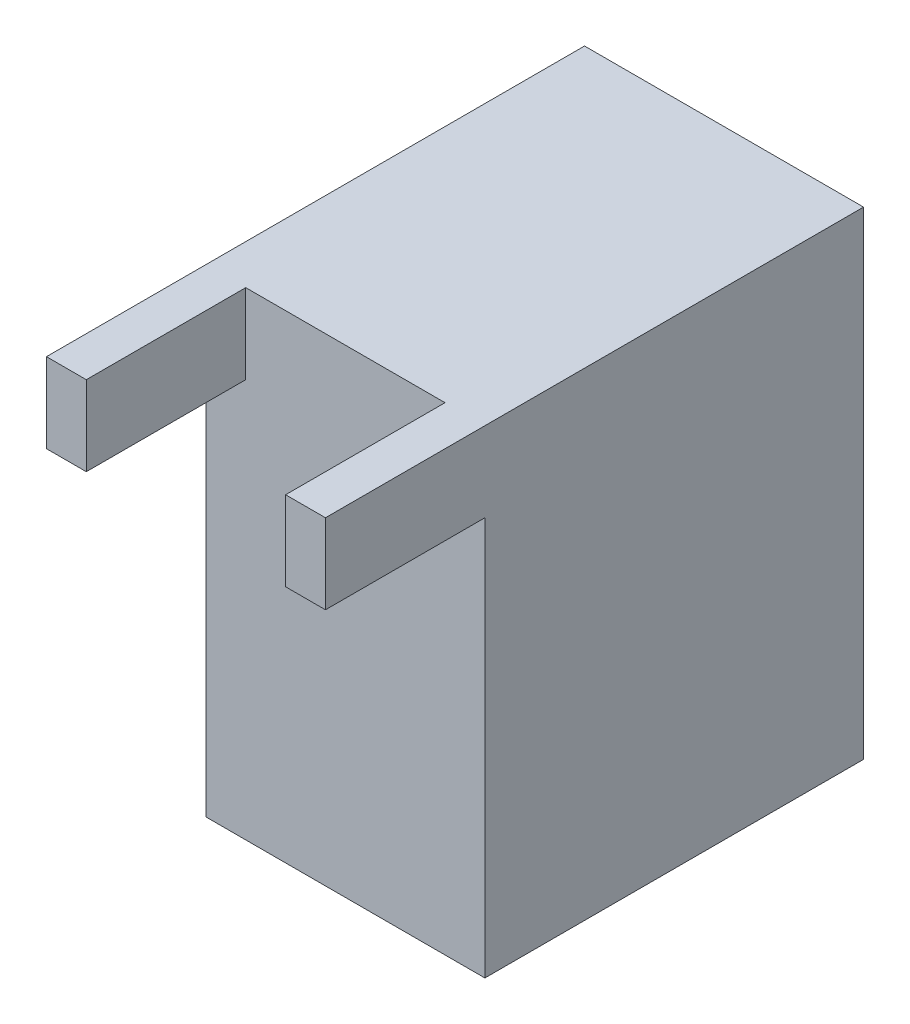
ISO-10303-21;
HEADER;
FILE_DESCRIPTION(('STEP AP214'),'2;1');
FILE_NAME('part.step','',(''),(''),'','','');
FILE_SCHEMA(('AUTOMOTIVE_DESIGN { 1 0 10303 214 1 1 1 1 }'));
ENDSEC;
DATA;
#1=APPLICATION_CONTEXT('core data for automotive mechanical design processes');
#2=APPLICATION_PROTOCOL_DEFINITION('international standard','automotive_design',2000,#1);
#3=PRODUCT_CONTEXT('',#1,'mechanical');
#4=PRODUCT('Part','Part','',(#3));
#5=PRODUCT_RELATED_PRODUCT_CATEGORY('part','',(#4));
#6=PRODUCT_DEFINITION_FORMATION('','',#4);
#7=PRODUCT_DEFINITION_CONTEXT('part definition',#1,'design');
#8=PRODUCT_DEFINITION('design','',#6,#7);
#9=PRODUCT_DEFINITION_SHAPE('','',#8);
#10=(LENGTH_UNIT() NAMED_UNIT(*) SI_UNIT(.MILLI.,.METRE.));
#11=(NAMED_UNIT(*) PLANE_ANGLE_UNIT() SI_UNIT($,.RADIAN.));
#12=(NAMED_UNIT(*) SI_UNIT($,.STERADIAN.) SOLID_ANGLE_UNIT());
#13=UNCERTAINTY_MEASURE_WITH_UNIT(LENGTH_MEASURE(1.E-05),#10,'distance_accuracy_value','');
#14=(GEOMETRIC_REPRESENTATION_CONTEXT(3) GLOBAL_UNCERTAINTY_ASSIGNED_CONTEXT((#13)) GLOBAL_UNIT_ASSIGNED_CONTEXT((#10,
#11,#12)) REPRESENTATION_CONTEXT('',''));
#15=CARTESIAN_POINT('',(0.,0.,0.));
#16=DIRECTION('',(0.,0.,1.));
#17=DIRECTION('',(1.,0.,0.));
#18=AXIS2_PLACEMENT_3D('',#15,#16,#17);
#19=CARTESIAN_POINT('',(-1.84818941504178,12.,3.83426183844011));
#20=DIRECTION('',(0.,0.,-1.));
#21=DIRECTION('',(-1.,0.,0.));
#22=AXIS2_PLACEMENT_3D('',#19,#20,#21);
#23=PLANE('',#22);
#24=DIRECTION('',(0.,-1.,0.));
#25=VECTOR('',#24,1.);
#26=CARTESIAN_POINT('',(4.15181058495822,12.,3.83426183844011));
#27=LINE('',#26,#25);
#28=CARTESIAN_POINT('',(4.15181058495822,12.,3.83426183844011));
#29=VERTEX_POINT('',#28);
#30=CARTESIAN_POINT('',(4.15181058495822,10.,3.83426183844011));
#31=VERTEX_POINT('',#30);
#32=EDGE_CURVE('E137',#29,#31,#27,.T.);
#33=ORIENTED_EDGE('',*,*,#32,.F.);
#34=DIRECTION('',(1.,0.,0.));
#35=VECTOR('',#34,1.);
#36=CARTESIAN_POINT('',(-1.84818941504178,12.,3.83426183844011));
#37=LINE('',#36,#35);
#38=CARTESIAN_POINT('',(-0.848189415041782,12.,3.83426183844011));
#39=VERTEX_POINT('',#38);
#40=EDGE_CURVE('E55',#39,#29,#37,.T.);
#41=ORIENTED_EDGE('',*,*,#40,.F.);
#42=DIRECTION('',(0.,1.,0.));
#43=VECTOR('',#42,1.);
#44=CARTESIAN_POINT('',(-0.848189415041782,12.,3.83426183844011));
#45=LINE('',#44,#43);
#46=CARTESIAN_POINT('',(-0.848189415041782,10.,3.83426183844011));
#47=VERTEX_POINT('',#46);
#48=EDGE_CURVE('E153',#47,#39,#45,.T.);
#49=ORIENTED_EDGE('',*,*,#48,.F.);
#50=DIRECTION('',(1.,0.,0.));
#51=VECTOR('',#50,1.);
#52=CARTESIAN_POINT('',(-1.84818941504178,10.,3.83426183844011));
#53=LINE('',#52,#51);
#54=CARTESIAN_POINT('',(-1.84818941504178,10.,3.83426183844011));
#55=VERTEX_POINT('',#54);
#56=EDGE_CURVE('E49',#55,#47,#53,.T.);
#57=ORIENTED_EDGE('',*,*,#56,.F.);
#58=DIRECTION('',(0.,-1.,0.));
#59=VECTOR('',#58,1.);
#60=CARTESIAN_POINT('',(-1.84818941504178,12.,3.83426183844011));
#61=LINE('',#60,#59);
#62=CARTESIAN_POINT('',(-1.84818941504178,0.,3.83426183844011));
#63=VERTEX_POINT('',#62);
#64=EDGE_CURVE('E11',#55,#63,#61,.T.);
#65=ORIENTED_EDGE('',*,*,#64,.T.);
#66=DIRECTION('',(1.,0.,0.));
#67=VECTOR('',#66,1.);
#68=CARTESIAN_POINT('',(-1.84818941504178,0.,3.83426183844011));
#69=LINE('',#68,#67);
#70=CARTESIAN_POINT('',(5.15181058495822,0.,3.83426183844011));
#71=VERTEX_POINT('',#70);
#72=EDGE_CURVE('E186',#63,#71,#69,.T.);
#73=ORIENTED_EDGE('',*,*,#72,.T.);
#74=DIRECTION('',(0.,-1.,0.));
#75=VECTOR('',#74,1.);
#76=CARTESIAN_POINT('',(5.15181058495822,12.,3.83426183844011));
#77=LINE('',#76,#75);
#78=CARTESIAN_POINT('',(5.15181058495822,10.,3.83426183844011));
#79=VERTEX_POINT('',#78);
#80=EDGE_CURVE('E43',#79,#71,#77,.T.);
#81=ORIENTED_EDGE('',*,*,#80,.F.);
#82=DIRECTION('',(1.,0.,0.));
#83=VECTOR('',#82,1.);
#84=CARTESIAN_POINT('',(5.15181058495822,10.,3.83426183844011));
#85=LINE('',#84,#83);
#86=EDGE_CURVE('E135',#31,#79,#85,.T.);
#87=ORIENTED_EDGE('',*,*,#86,.F.);
#88=EDGE_LOOP('',(#33,#41,#49,#57,#65,#73,#81,#87));
#89=FACE_BOUND('',#88,.T.);
#90=ADVANCED_FACE('F35',(#89),#23,.F.);
#91=CARTESIAN_POINT('',(-1.84818941504178,12.,-5.66573816155989));
#92=DIRECTION('',(1.,0.,0.));
#93=DIRECTION('',(0.,0.,-1.));
#94=AXIS2_PLACEMENT_3D('',#91,#92,#93);
#95=PLANE('',#94);
#96=DIRECTION('',(0.,0.,1.));
#97=VECTOR('',#96,1.);
#98=CARTESIAN_POINT('',(-1.84818941504178,0.,-5.66573816155989));
#99=LINE('',#98,#97);
#100=CARTESIAN_POINT('',(-1.84818941504178,0.,-5.66573816155989));
#101=VERTEX_POINT('',#100);
#102=EDGE_CURVE('E175',#101,#63,#99,.T.);
#103=ORIENTED_EDGE('',*,*,#102,.T.);
#104=ORIENTED_EDGE('',*,*,#64,.F.);
#105=DIRECTION('',(0.,0.,-1.));
#106=VECTOR('',#105,1.);
#107=CARTESIAN_POINT('',(-1.84818941504178,10.,7.83426183844011));
#108=LINE('',#107,#106);
#109=CARTESIAN_POINT('',(-1.84818941504178,10.,7.83426183844011));
#110=VERTEX_POINT('',#109);
#111=EDGE_CURVE('E168',#110,#55,#108,.T.);
#112=ORIENTED_EDGE('',*,*,#111,.F.);
#113=DIRECTION('',(0.,-1.,0.));
#114=VECTOR('',#113,1.);
#115=CARTESIAN_POINT('',(-1.84818941504178,12.,7.83426183844011));
#116=LINE('',#115,#114);
#117=CARTESIAN_POINT('',(-1.84818941504178,12.,7.83426183844011));
#118=VERTEX_POINT('',#117);
#119=EDGE_CURVE('E149',#118,#110,#116,.T.);
#120=ORIENTED_EDGE('',*,*,#119,.F.);
#121=DIRECTION('',(0.,0.,1.));
#122=VECTOR('',#121,1.);
#123=CARTESIAN_POINT('',(-1.84818941504178,12.,-5.66573816155989));
#124=LINE('',#123,#122);
#125=CARTESIAN_POINT('',(-1.84818941504178,12.,-5.66573816155989));
#126=VERTEX_POINT('',#125);
#127=EDGE_CURVE('E178',#126,#118,#124,.T.);
#128=ORIENTED_EDGE('',*,*,#127,.F.);
#129=DIRECTION('',(0.,-1.,0.));
#130=VECTOR('',#129,1.);
#131=CARTESIAN_POINT('',(-1.84818941504178,12.,-5.66573816155989));
#132=LINE('',#131,#130);
#133=EDGE_CURVE('E183',#126,#101,#132,.T.);
#134=ORIENTED_EDGE('',*,*,#133,.T.);
#135=EDGE_LOOP('',(#103,#104,#112,#120,#128,#134));
#136=FACE_BOUND('',#135,.T.);
#137=ADVANCED_FACE('F37',(#136),#95,.F.);
#138=CARTESIAN_POINT('',(5.15181058495822,12.,-5.66573816155989));
#139=DIRECTION('',(-1.,0.,0.));
#140=DIRECTION('',(0.,0.,1.));
#141=AXIS2_PLACEMENT_3D('',#138,#139,#140);
#142=PLANE('',#141);
#143=DIRECTION('',(0.,0.,-1.));
#144=VECTOR('',#143,1.);
#145=CARTESIAN_POINT('',(5.15181058495822,0.,-5.66573816155989));
#146=LINE('',#145,#144);
#147=CARTESIAN_POINT('',(5.15181058495822,0.,-5.66573816155989));
#148=VERTEX_POINT('',#147);
#149=EDGE_CURVE('E189',#71,#148,#146,.T.);
#150=ORIENTED_EDGE('',*,*,#149,.T.);
#151=DIRECTION('',(0.,-1.,0.));
#152=VECTOR('',#151,1.);
#153=CARTESIAN_POINT('',(5.15181058495822,12.,-5.66573816155989));
#154=LINE('',#153,#152);
#155=CARTESIAN_POINT('',(5.15181058495822,12.,-5.66573816155989));
#156=VERTEX_POINT('',#155);
#157=EDGE_CURVE('E118',#156,#148,#154,.T.);
#158=ORIENTED_EDGE('',*,*,#157,.F.);
#159=DIRECTION('',(0.,0.,-1.));
#160=VECTOR('',#159,1.);
#161=CARTESIAN_POINT('',(5.15181058495822,12.,-5.66573816155989));
#162=LINE('',#161,#160);
#163=CARTESIAN_POINT('',(5.15181058495822,12.,7.83426183844011));
#164=VERTEX_POINT('',#163);
#165=EDGE_CURVE('E111',#164,#156,#162,.T.);
#166=ORIENTED_EDGE('',*,*,#165,.F.);
#167=DIRECTION('',(0.,1.,0.));
#168=VECTOR('',#167,1.);
#169=CARTESIAN_POINT('',(5.15181058495822,12.,7.83426183844011));
#170=LINE('',#169,#168);
#171=CARTESIAN_POINT('',(5.15181058495822,10.,7.83426183844011));
#172=VERTEX_POINT('',#171);
#173=EDGE_CURVE('E116',#172,#164,#170,.T.);
#174=ORIENTED_EDGE('',*,*,#173,.F.);
#175=DIRECTION('',(0.,0.,-1.));
#176=VECTOR('',#175,1.);
#177=CARTESIAN_POINT('',(5.15181058495822,10.,7.83426183844011));
#178=LINE('',#177,#176);
#179=EDGE_CURVE('E142',#172,#79,#178,.T.);
#180=ORIENTED_EDGE('',*,*,#179,.T.);
#181=ORIENTED_EDGE('',*,*,#80,.T.);
#182=EDGE_LOOP('',(#150,#158,#166,#174,#180,#181));
#183=FACE_BOUND('',#182,.T.);
#184=ADVANCED_FACE('F113',(#183),#142,.F.);
#185=CARTESIAN_POINT('',(-1.84818941504178,12.,-5.66573816155989));
#186=DIRECTION('',(0.,0.,1.));
#187=DIRECTION('',(1.,0.,0.));
#188=AXIS2_PLACEMENT_3D('',#185,#186,#187);
#189=PLANE('',#188);
#190=DIRECTION('',(-1.,0.,0.));
#191=VECTOR('',#190,1.);
#192=CARTESIAN_POINT('',(-1.84818941504178,0.,-5.66573816155989));
#193=LINE('',#192,#191);
#194=EDGE_CURVE('E180',#148,#101,#193,.T.);
#195=ORIENTED_EDGE('',*,*,#194,.T.);
#196=ORIENTED_EDGE('',*,*,#133,.F.);
#197=DIRECTION('',(-1.,0.,0.));
#198=VECTOR('',#197,1.);
#199=CARTESIAN_POINT('',(-1.84818941504178,12.,-5.66573816155989));
#200=LINE('',#199,#198);
#201=EDGE_CURVE('E121',#156,#126,#200,.T.);
#202=ORIENTED_EDGE('',*,*,#201,.F.);
#203=ORIENTED_EDGE('',*,*,#157,.T.);
#204=EDGE_LOOP('',(#195,#196,#202,#203));
#205=FACE_BOUND('',#204,.T.);
#206=ADVANCED_FACE('F204',(#205),#189,.F.);
#207=CARTESIAN_POINT('',(0.,12.,0.));
#208=DIRECTION('',(0.,1.,0.));
#209=DIRECTION('',(0.,0.,1.));
#210=AXIS2_PLACEMENT_3D('',#207,#208,#209);
#211=PLANE('',#210);
#212=ORIENTED_EDGE('',*,*,#127,.T.);
#213=DIRECTION('',(-1.,0.,0.));
#214=VECTOR('',#213,1.);
#215=CARTESIAN_POINT('',(-1.84818941504178,12.,7.83426183844011));
#216=LINE('',#215,#214);
#217=CARTESIAN_POINT('',(-0.848189415041782,12.,7.83426183844011));
#218=VERTEX_POINT('',#217);
#219=EDGE_CURVE('E157',#218,#118,#216,.T.);
#220=ORIENTED_EDGE('',*,*,#219,.F.);
#221=DIRECTION('',(0.,0.,-1.));
#222=VECTOR('',#221,1.);
#223=CARTESIAN_POINT('',(-0.848189415041782,12.,7.83426183844011));
#224=LINE('',#223,#222);
#225=EDGE_CURVE('E160',#218,#39,#224,.T.);
#226=ORIENTED_EDGE('',*,*,#225,.T.);
#227=ORIENTED_EDGE('',*,*,#40,.T.);
#228=DIRECTION('',(0.,0.,-1.));
#229=VECTOR('',#228,1.);
#230=CARTESIAN_POINT('',(4.15181058495822,12.,7.83426183844011));
#231=LINE('',#230,#229);
#232=CARTESIAN_POINT('',(4.15181058495822,12.,7.83426183844011));
#233=VERTEX_POINT('',#232);
#234=EDGE_CURVE('E126',#233,#29,#231,.T.);
#235=ORIENTED_EDGE('',*,*,#234,.F.);
#236=DIRECTION('',(-1.,0.,0.));
#237=VECTOR('',#236,1.);
#238=CARTESIAN_POINT('',(5.15181058495822,12.,7.83426183844011));
#239=LINE('',#238,#237);
#240=EDGE_CURVE('E124',#164,#233,#239,.T.);
#241=ORIENTED_EDGE('',*,*,#240,.F.);
#242=ORIENTED_EDGE('',*,*,#165,.T.);
#243=ORIENTED_EDGE('',*,*,#201,.T.);
#244=EDGE_LOOP('',(#212,#220,#226,#227,#235,#241,#242,#243));
#245=FACE_BOUND('',#244,.T.);
#246=ADVANCED_FACE('F125',(#245),#211,.T.);
#247=CARTESIAN_POINT('',(0.,0.,0.));
#248=DIRECTION('',(0.,1.,0.));
#249=DIRECTION('',(0.,0.,1.));
#250=AXIS2_PLACEMENT_3D('',#247,#248,#249);
#251=PLANE('',#250);
#252=CARTESIAN_POINT('',(1.65181058495822,0.,-0.165738161559888));
#253=DIRECTION('',(0.,-1.,0.));
#254=DIRECTION('',(0.,0.,-1.));
#255=AXIS2_PLACEMENT_3D('',#252,#253,#254);
#256=CIRCLE('',#255,3.15);
#257=CARTESIAN_POINT('',(1.65181058495822,0.,-3.31573816155989));
#258=VERTEX_POINT('',#257);
#259=EDGE_CURVE('E171',#258,#258,#256,.T.);
#260=ORIENTED_EDGE('',*,*,#259,.F.);
#261=EDGE_LOOP('',(#260));
#262=FACE_BOUND('',#261,.T.);
#263=ORIENTED_EDGE('',*,*,#102,.F.);
#264=ORIENTED_EDGE('',*,*,#194,.F.);
#265=ORIENTED_EDGE('',*,*,#149,.F.);
#266=ORIENTED_EDGE('',*,*,#72,.F.);
#267=EDGE_LOOP('',(#263,#264,#265,#266));
#268=FACE_BOUND('',#267,.T.);
#269=ADVANCED_FACE('F201',(#262,#268),#251,.F.);
#270=CARTESIAN_POINT('',(1.65181058495822,11.,-0.165738161559888));
#271=DIRECTION('',(0.,-1.,0.));
#272=DIRECTION('',(0.,0.,-1.));
#273=AXIS2_PLACEMENT_3D('',#270,#271,#272);
#274=CYLINDRICAL_SURFACE('',#273,3.15);
#275=CARTESIAN_POINT('',(1.65181058495822,11.,-0.165738161559888));
#276=DIRECTION('',(0.,-1.,0.));
#277=DIRECTION('',(0.,0.,-1.));
#278=AXIS2_PLACEMENT_3D('',#275,#276,#277);
#279=CIRCLE('',#278,3.15);
#280=CARTESIAN_POINT('',(1.65181058495822,11.,-3.31573816155989));
#281=VERTEX_POINT('',#280);
#282=EDGE_CURVE('E172',#281,#281,#279,.T.);
#283=ORIENTED_EDGE('',*,*,#282,.F.);
#284=EDGE_LOOP('',(#283));
#285=FACE_BOUND('',#284,.T.);
#286=ORIENTED_EDGE('',*,*,#259,.T.);
#287=EDGE_LOOP('',(#286));
#288=FACE_BOUND('',#287,.T.);
#289=ADVANCED_FACE('F227',(#285,#288),#274,.F.);
#290=CARTESIAN_POINT('',(1.65181058495822,11.,-0.165738161559888));
#291=DIRECTION('',(0.,-1.,0.));
#292=DIRECTION('',(0.,0.,-1.));
#293=AXIS2_PLACEMENT_3D('',#290,#291,#292);
#294=PLANE('',#293);
#295=ORIENTED_EDGE('',*,*,#282,.T.);
#296=EDGE_LOOP('',(#295));
#297=FACE_BOUND('',#296,.T.);
#298=ADVANCED_FACE('F220',(#297),#294,.T.);
#299=CARTESIAN_POINT('',(-1.84818941504178,10.,7.83426183844011));
#300=DIRECTION('',(0.,1.,0.));
#301=DIRECTION('',(0.,0.,1.));
#302=AXIS2_PLACEMENT_3D('',#299,#300,#301);
#303=PLANE('',#302);
#304=ORIENTED_EDGE('',*,*,#56,.T.);
#305=DIRECTION('',(0.,0.,-1.));
#306=VECTOR('',#305,1.);
#307=CARTESIAN_POINT('',(-0.848189415041782,10.,7.83426183844011));
#308=LINE('',#307,#306);
#309=CARTESIAN_POINT('',(-0.848189415041782,10.,7.83426183844011));
#310=VERTEX_POINT('',#309);
#311=EDGE_CURVE('E165',#310,#47,#308,.T.);
#312=ORIENTED_EDGE('',*,*,#311,.F.);
#313=DIRECTION('',(1.,0.,0.));
#314=VECTOR('',#313,1.);
#315=CARTESIAN_POINT('',(-1.84818941504178,10.,7.83426183844011));
#316=LINE('',#315,#314);
#317=EDGE_CURVE('E152',#110,#310,#316,.T.);
#318=ORIENTED_EDGE('',*,*,#317,.F.);
#319=ORIENTED_EDGE('',*,*,#111,.T.);
#320=EDGE_LOOP('',(#304,#312,#318,#319));
#321=FACE_BOUND('',#320,.T.);
#322=ADVANCED_FACE('F218',(#321),#303,.F.);
#323=CARTESIAN_POINT('',(-0.848189415041782,12.,7.83426183844011));
#324=DIRECTION('',(-1.,0.,0.));
#325=DIRECTION('',(0.,-1.,0.));
#326=AXIS2_PLACEMENT_3D('',#323,#324,#325);
#327=PLANE('',#326);
#328=ORIENTED_EDGE('',*,*,#48,.T.);
#329=ORIENTED_EDGE('',*,*,#225,.F.);
#330=DIRECTION('',(0.,1.,0.));
#331=VECTOR('',#330,1.);
#332=CARTESIAN_POINT('',(-0.848189415041782,12.,7.83426183844011));
#333=LINE('',#332,#331);
#334=EDGE_CURVE('E155',#310,#218,#333,.T.);
#335=ORIENTED_EDGE('',*,*,#334,.F.);
#336=ORIENTED_EDGE('',*,*,#311,.T.);
#337=EDGE_LOOP('',(#328,#329,#335,#336));
#338=FACE_BOUND('',#337,.T.);
#339=ADVANCED_FACE('F216',(#338),#327,.F.);
#340=CARTESIAN_POINT('',(0.,0.,7.83426183844011));
#341=DIRECTION('',(0.,0.,1.));
#342=DIRECTION('',(1.,0.,0.));
#343=AXIS2_PLACEMENT_3D('',#340,#341,#342);
#344=PLANE('',#343);
#345=ORIENTED_EDGE('',*,*,#119,.T.);
#346=ORIENTED_EDGE('',*,*,#317,.T.);
#347=ORIENTED_EDGE('',*,*,#334,.T.);
#348=ORIENTED_EDGE('',*,*,#219,.T.);
#349=EDGE_LOOP('',(#345,#346,#347,#348));
#350=FACE_BOUND('',#349,.T.);
#351=ADVANCED_FACE('F211',(#350),#344,.T.);
#352=CARTESIAN_POINT('',(4.15181058495822,12.,7.83426183844011));
#353=DIRECTION('',(1.,0.,0.));
#354=DIRECTION('',(0.,0.,-1.));
#355=AXIS2_PLACEMENT_3D('',#352,#353,#354);
#356=PLANE('',#355);
#357=ORIENTED_EDGE('',*,*,#32,.T.);
#358=DIRECTION('',(0.,0.,-1.));
#359=VECTOR('',#358,1.);
#360=CARTESIAN_POINT('',(4.15181058495822,10.,7.83426183844011));
#361=LINE('',#360,#359);
#362=CARTESIAN_POINT('',(4.15181058495822,10.,7.83426183844011));
#363=VERTEX_POINT('',#362);
#364=EDGE_CURVE('E145',#363,#31,#361,.T.);
#365=ORIENTED_EDGE('',*,*,#364,.F.);
#366=DIRECTION('',(0.,-1.,0.));
#367=VECTOR('',#366,1.);
#368=CARTESIAN_POINT('',(4.15181058495822,12.,7.83426183844011));
#369=LINE('',#368,#367);
#370=EDGE_CURVE('E129',#233,#363,#369,.T.);
#371=ORIENTED_EDGE('',*,*,#370,.F.);
#372=ORIENTED_EDGE('',*,*,#234,.T.);
#373=EDGE_LOOP('',(#357,#365,#371,#372));
#374=FACE_BOUND('',#373,.T.);
#375=ADVANCED_FACE('F301',(#374),#356,.F.);
#376=CARTESIAN_POINT('',(5.15181058495822,10.,7.83426183844011));
#377=DIRECTION('',(0.,1.,0.));
#378=DIRECTION('',(0.,0.,1.));
#379=AXIS2_PLACEMENT_3D('',#376,#377,#378);
#380=PLANE('',#379);
#381=ORIENTED_EDGE('',*,*,#86,.T.);
#382=ORIENTED_EDGE('',*,*,#179,.F.);
#383=DIRECTION('',(1.,0.,0.));
#384=VECTOR('',#383,1.);
#385=CARTESIAN_POINT('',(5.15181058495822,10.,7.83426183844011));
#386=LINE('',#385,#384);
#387=EDGE_CURVE('E133',#363,#172,#386,.T.);
#388=ORIENTED_EDGE('',*,*,#387,.F.);
#389=ORIENTED_EDGE('',*,*,#364,.T.);
#390=EDGE_LOOP('',(#381,#382,#388,#389));
#391=FACE_BOUND('',#390,.T.);
#392=ADVANCED_FACE('F310',(#391),#380,.F.);
#393=CARTESIAN_POINT('',(0.,0.,7.83426183844011));
#394=DIRECTION('',(0.,0.,-1.));
#395=DIRECTION('',(-1.,0.,0.));
#396=AXIS2_PLACEMENT_3D('',#393,#394,#395);
#397=PLANE('',#396);
#398=ORIENTED_EDGE('',*,*,#173,.T.);
#399=ORIENTED_EDGE('',*,*,#240,.T.);
#400=ORIENTED_EDGE('',*,*,#370,.T.);
#401=ORIENTED_EDGE('',*,*,#387,.T.);
#402=EDGE_LOOP('',(#398,#399,#400,#401));
#403=FACE_BOUND('',#402,.T.);
#404=ADVANCED_FACE('F131',(#403),#397,.F.);
#405=CLOSED_SHELL('',(#90,#137,#184,#206,#246,#269,#289,#298,#322,#339,#351,#375,#392,#404));
#406=MANIFOLD_SOLID_BREP('B2',#405);
#407=ADVANCED_BREP_SHAPE_REPRESENTATION('',(#18,#406),#14);
#408=SHAPE_DEFINITION_REPRESENTATION(#9,#407);
ENDSEC;
END-ISO-10303-21;
